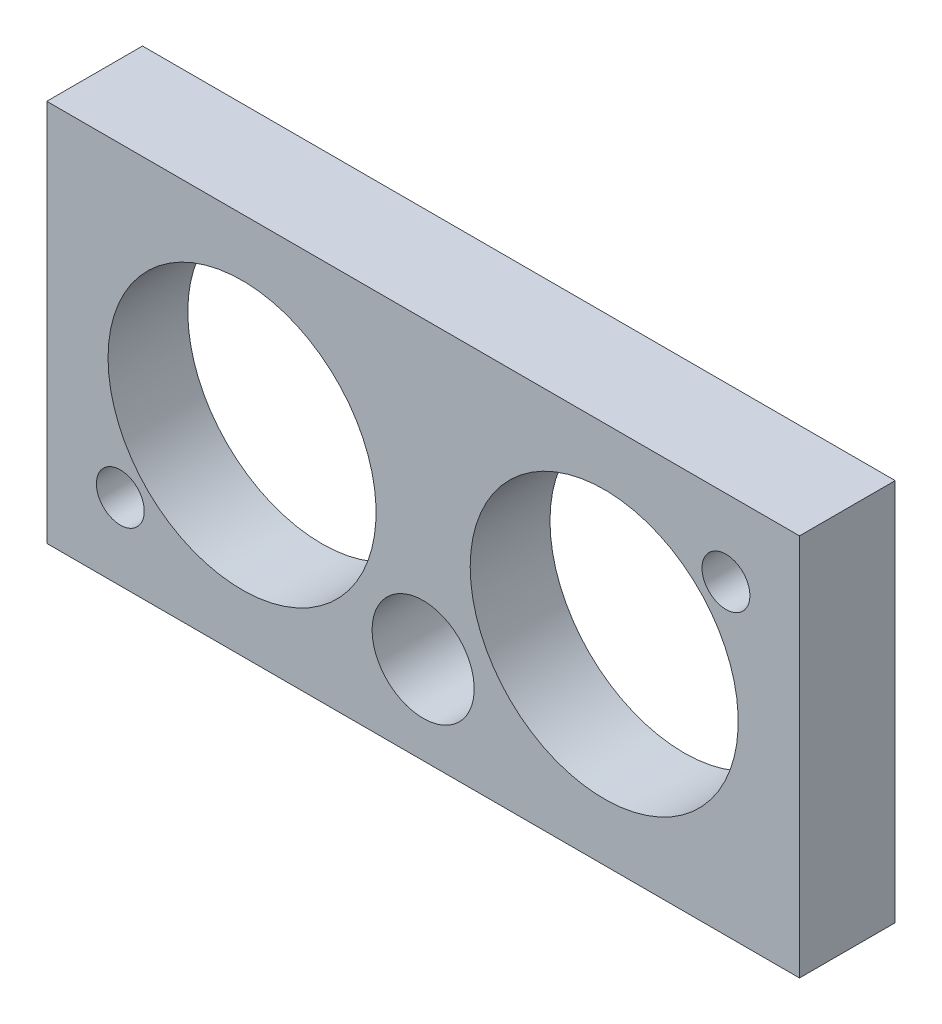
ISO-10303-21;
HEADER;
FILE_DESCRIPTION(('STEP AP214'),'2;1');
FILE_NAME('part.step','',(''),(''),'','','');
FILE_SCHEMA(('AUTOMOTIVE_DESIGN { 1 0 10303 214 1 1 1 1 }'));
ENDSEC;
DATA;
#1=APPLICATION_CONTEXT('core data for automotive mechanical design processes');
#2=APPLICATION_PROTOCOL_DEFINITION('international standard','automotive_design',2000,#1);
#3=PRODUCT_CONTEXT('',#1,'mechanical');
#4=PRODUCT('Part','Part','',(#3));
#5=PRODUCT_RELATED_PRODUCT_CATEGORY('part','',(#4));
#6=PRODUCT_DEFINITION_FORMATION('','',#4);
#7=PRODUCT_DEFINITION_CONTEXT('part definition',#1,'design');
#8=PRODUCT_DEFINITION('design','',#6,#7);
#9=PRODUCT_DEFINITION_SHAPE('','',#8);
#10=(LENGTH_UNIT() NAMED_UNIT(*) SI_UNIT(.MILLI.,.METRE.));
#11=(NAMED_UNIT(*) PLANE_ANGLE_UNIT() SI_UNIT($,.RADIAN.));
#12=(NAMED_UNIT(*) SI_UNIT($,.STERADIAN.) SOLID_ANGLE_UNIT());
#13=UNCERTAINTY_MEASURE_WITH_UNIT(LENGTH_MEASURE(1.E-05),#10,'distance_accuracy_value','');
#14=(GEOMETRIC_REPRESENTATION_CONTEXT(3) GLOBAL_UNCERTAINTY_ASSIGNED_CONTEXT((#13)) GLOBAL_UNIT_ASSIGNED_CONTEXT((#10,
#11,#12)) REPRESENTATION_CONTEXT('',''));
#15=CARTESIAN_POINT('',(0.,0.,0.));
#16=DIRECTION('',(0.,0.,1.));
#17=DIRECTION('',(1.,0.,0.));
#18=AXIS2_PLACEMENT_3D('',#15,#16,#17);
#19=CARTESIAN_POINT('',(-72.3984925993431,-20.8189630661845,2.07722565940972E-13));
#20=DIRECTION('',(0.,0.,1.));
#21=DIRECTION('',(1.,0.,0.));
#22=AXIS2_PLACEMENT_3D('',#19,#20,#21);
#23=PLANE('',#22);
#24=DIRECTION('',(0.,1.,0.));
#25=VECTOR('',#24,1.);
#26=CARTESIAN_POINT('',(-74.3984925993431,-22.8189630661845,2.08166817117217E-13));
#27=LINE('',#26,#25);
#28=CARTESIAN_POINT('',(-74.3984925993431,-22.8189630661845,2.08166817117217E-13));
#29=VERTEX_POINT('',#28);
#30=CARTESIAN_POINT('',(-74.3984925993431,1.18103693381549,2.08166817117217E-13));
#31=VERTEX_POINT('',#30);
#32=EDGE_CURVE('E47',#29,#31,#27,.T.);
#33=ORIENTED_EDGE('',*,*,#32,.T.);
#34=DIRECTION('',(1.,0.,0.));
#35=VECTOR('',#34,1.);
#36=CARTESIAN_POINT('',(-74.3984925993431,1.18103693381549,2.08166817117217E-13));
#37=LINE('',#36,#35);
#38=CARTESIAN_POINT('',(-27.2184925993431,1.18103693381549,2.08166817117217E-13));
#39=VERTEX_POINT('',#38);
#40=EDGE_CURVE('E218',#31,#39,#37,.T.);
#41=ORIENTED_EDGE('',*,*,#40,.T.);
#42=DIRECTION('',(0.,-1.,0.));
#43=VECTOR('',#42,1.);
#44=CARTESIAN_POINT('',(-27.2184925993431,-22.8189630661845,2.08166817117217E-13));
#45=LINE('',#44,#43);
#46=CARTESIAN_POINT('',(-27.2184925993431,-22.8189630661845,1.94289029309402E-13));
#47=VERTEX_POINT('',#46);
#48=EDGE_CURVE('E216',#39,#47,#45,.T.);
#49=ORIENTED_EDGE('',*,*,#48,.T.);
#50=DIRECTION('',(-1.,0.,0.));
#51=VECTOR('',#50,1.);
#52=CARTESIAN_POINT('',(-74.3984925993431,-22.8189630661845,2.08166817117217E-13));
#53=LINE('',#52,#51);
#54=EDGE_CURVE('E11',#47,#29,#53,.T.);
#55=ORIENTED_EDGE('',*,*,#54,.T.);
#56=EDGE_LOOP('',(#33,#41,#49,#55));
#57=FACE_BOUND('',#56,.T.);
#58=DIRECTION('',(0.,1.,0.));
#59=VECTOR('',#58,1.);
#60=CARTESIAN_POINT('',(-29.0184925993431,-0.618963066184508,2.08166817117217E-13));
#61=LINE('',#60,#59);
#62=CARTESIAN_POINT('',(-29.0184925993431,-21.0189630661845,2.07722565940972E-13));
#63=VERTEX_POINT('',#62);
#64=CARTESIAN_POINT('',(-29.0184925993431,-0.618963066184508,2.08166817117217E-13));
#65=VERTEX_POINT('',#64);
#66=EDGE_CURVE('E136',#63,#65,#61,.T.);
#67=ORIENTED_EDGE('',*,*,#66,.T.);
#68=DIRECTION('',(-1.,0.,0.));
#69=VECTOR('',#68,1.);
#70=CARTESIAN_POINT('',(-72.5984925993431,-0.618963066184508,2.08166817117217E-13));
#71=LINE('',#70,#69);
#72=CARTESIAN_POINT('',(-72.5984925993431,-0.618963066184508,2.08166817117217E-13));
#73=VERTEX_POINT('',#72);
#74=EDGE_CURVE('E164',#65,#73,#71,.T.);
#75=ORIENTED_EDGE('',*,*,#74,.T.);
#76=DIRECTION('',(0.,-1.,0.));
#77=VECTOR('',#76,1.);
#78=CARTESIAN_POINT('',(-72.5984925993431,-21.0189630661845,2.08166817117217E-13));
#79=LINE('',#78,#77);
#80=CARTESIAN_POINT('',(-72.5984925993431,-21.0189630661845,2.08166817117217E-13));
#81=VERTEX_POINT('',#80);
#82=EDGE_CURVE('E456',#73,#81,#79,.T.);
#83=ORIENTED_EDGE('',*,*,#82,.T.);
#84=DIRECTION('',(1.,0.,0.));
#85=VECTOR('',#84,1.);
#86=CARTESIAN_POINT('',(-29.0184925993431,-21.0189630661845,2.08166817117217E-13));
#87=LINE('',#86,#85);
#88=EDGE_CURVE('E133',#81,#63,#87,.T.);
#89=ORIENTED_EDGE('',*,*,#88,.T.);
#90=EDGE_LOOP('',(#67,#75,#83,#89));
#91=FACE_BOUND('',#90,.T.);
#92=ADVANCED_FACE('F38',(#57,#91),#23,.F.);
#93=CARTESIAN_POINT('',(-31.8282397032408,-3.61896306618451,6.00000000000021));
#94=DIRECTION('',(0.,0.,-1.));
#95=DIRECTION('',(-1.,0.,0.));
#96=AXIS2_PLACEMENT_3D('',#93,#94,#95);
#97=CYLINDRICAL_SURFACE('',#96,1.5);
#98=CARTESIAN_POINT('',(-31.8282397032408,-3.61896306618451,6.00000000000021));
#99=DIRECTION('',(0.,0.,-1.));
#100=DIRECTION('',(-1.,0.,0.));
#101=AXIS2_PLACEMENT_3D('',#98,#99,#100);
#102=CIRCLE('',#101,1.5);
#103=CARTESIAN_POINT('',(-33.3282397032408,-3.61896306618451,6.00000000000021));
#104=VERTEX_POINT('',#103);
#105=EDGE_CURVE('E205',#104,#104,#102,.T.);
#106=ORIENTED_EDGE('',*,*,#105,.F.);
#107=EDGE_LOOP('',(#106));
#108=FACE_BOUND('',#107,.T.);
#109=CARTESIAN_POINT('',(-31.8282397032408,-3.61896306618451,1.00000000000021));
#110=DIRECTION('',(0.,0.,-1.));
#111=DIRECTION('',(-1.,0.,0.));
#112=AXIS2_PLACEMENT_3D('',#109,#110,#111);
#113=CIRCLE('',#112,1.5);
#114=CARTESIAN_POINT('',(-33.3282397032408,-3.61896306618451,1.00000000000021));
#115=VERTEX_POINT('',#114);
#116=EDGE_CURVE('E42',#115,#115,#113,.F.);
#117=ORIENTED_EDGE('',*,*,#116,.F.);
#118=EDGE_LOOP('',(#117));
#119=FACE_BOUND('',#118,.T.);
#120=ADVANCED_FACE('F268',(#108,#119),#97,.F.);
#121=CARTESIAN_POINT('',(-69.7887454954455,-18.0189630661845,6.00000000000021));
#122=DIRECTION('',(0.,0.,-1.));
#123=DIRECTION('',(-1.,0.,0.));
#124=AXIS2_PLACEMENT_3D('',#121,#122,#123);
#125=CYLINDRICAL_SURFACE('',#124,1.5);
#126=CARTESIAN_POINT('',(-69.7887454954455,-18.0189630661845,6.00000000000021));
#127=DIRECTION('',(0.,0.,-1.));
#128=DIRECTION('',(-1.,0.,0.));
#129=AXIS2_PLACEMENT_3D('',#126,#127,#128);
#130=CIRCLE('',#129,1.5);
#131=CARTESIAN_POINT('',(-71.2887454954455,-18.0189630661845,6.00000000000021));
#132=VERTEX_POINT('',#131);
#133=EDGE_CURVE('E211',#132,#132,#130,.T.);
#134=ORIENTED_EDGE('',*,*,#133,.F.);
#135=EDGE_LOOP('',(#134));
#136=FACE_BOUND('',#135,.T.);
#137=CARTESIAN_POINT('',(-69.7887454954455,-18.0189630661845,1.00000000000021));
#138=DIRECTION('',(0.,0.,-1.));
#139=DIRECTION('',(-1.,0.,0.));
#140=AXIS2_PLACEMENT_3D('',#137,#138,#139);
#141=CIRCLE('',#140,1.5);
#142=CARTESIAN_POINT('',(-71.2887454954455,-18.0189630661845,1.00000000000021));
#143=VERTEX_POINT('',#142);
#144=EDGE_CURVE('E195',#143,#143,#141,.F.);
#145=ORIENTED_EDGE('',*,*,#144,.F.);
#146=EDGE_LOOP('',(#145));
#147=FACE_BOUND('',#146,.T.);
#148=ADVANCED_FACE('F274',(#136,#147),#125,.F.);
#149=CARTESIAN_POINT('',(-74.3984925993431,-22.8189630661845,-52.9334714523805));
#150=DIRECTION('',(-1.,0.,0.));
#151=DIRECTION('',(0.,0.,1.));
#152=AXIS2_PLACEMENT_3D('',#149,#150,#151);
#153=PLANE('',#152);
#154=ORIENTED_EDGE('',*,*,#32,.F.);
#155=DIRECTION('',(0.,0.,1.));
#156=VECTOR('',#155,1.);
#157=CARTESIAN_POINT('',(-74.3984925993431,-22.8189630661845,-52.9334714523805));
#158=LINE('',#157,#156);
#159=CARTESIAN_POINT('',(-74.3984925993431,-22.8189630661845,6.00000000000021));
#160=VERTEX_POINT('',#159);
#161=EDGE_CURVE('E233',#29,#160,#158,.T.);
#162=ORIENTED_EDGE('',*,*,#161,.T.);
#163=DIRECTION('',(0.,-1.,0.));
#164=VECTOR('',#163,1.);
#165=CARTESIAN_POINT('',(-74.3984925993431,-22.8189630661845,6.00000000000021));
#166=LINE('',#165,#164);
#167=CARTESIAN_POINT('',(-74.3984925993431,1.18103693381549,6.00000000000021));
#168=VERTEX_POINT('',#167);
#169=EDGE_CURVE('E214',#168,#160,#166,.T.);
#170=ORIENTED_EDGE('',*,*,#169,.F.);
#171=DIRECTION('',(0.,0.,1.));
#172=VECTOR('',#171,1.);
#173=CARTESIAN_POINT('',(-74.3984925993431,1.18103693381549,-52.9334714523805));
#174=LINE('',#173,#172);
#175=EDGE_CURVE('E219',#31,#168,#174,.T.);
#176=ORIENTED_EDGE('',*,*,#175,.F.);
#177=EDGE_LOOP('',(#154,#162,#170,#176));
#178=FACE_BOUND('',#177,.T.);
#179=ADVANCED_FACE('F40',(#178),#153,.T.);
#180=CARTESIAN_POINT('',(-74.3984925993431,1.18103693381549,-52.9334714523805));
#181=DIRECTION('',(0.,1.,0.));
#182=DIRECTION('',(0.,0.,1.));
#183=AXIS2_PLACEMENT_3D('',#180,#181,#182);
#184=PLANE('',#183);
#185=ORIENTED_EDGE('',*,*,#40,.F.);
#186=ORIENTED_EDGE('',*,*,#175,.T.);
#187=DIRECTION('',(-1.,0.,0.));
#188=VECTOR('',#187,1.);
#189=CARTESIAN_POINT('',(-74.3984925993431,1.18103693381549,6.00000000000021));
#190=LINE('',#189,#188);
#191=CARTESIAN_POINT('',(-27.2184925993431,1.18103693381549,6.00000000000021));
#192=VERTEX_POINT('',#191);
#193=EDGE_CURVE('E230',#192,#168,#190,.T.);
#194=ORIENTED_EDGE('',*,*,#193,.F.);
#195=DIRECTION('',(0.,0.,1.));
#196=VECTOR('',#195,1.);
#197=CARTESIAN_POINT('',(-27.2184925993431,1.18103693381549,-52.9334714523805));
#198=LINE('',#197,#196);
#199=EDGE_CURVE('E235',#39,#192,#198,.T.);
#200=ORIENTED_EDGE('',*,*,#199,.F.);
#201=EDGE_LOOP('',(#185,#186,#194,#200));
#202=FACE_BOUND('',#201,.T.);
#203=ADVANCED_FACE('F285',(#202),#184,.T.);
#204=CARTESIAN_POINT('',(-27.2184925993431,-22.8189630661845,-52.9334714523805));
#205=DIRECTION('',(1.,0.,0.));
#206=DIRECTION('',(0.,0.,-1.));
#207=AXIS2_PLACEMENT_3D('',#204,#205,#206);
#208=PLANE('',#207);
#209=ORIENTED_EDGE('',*,*,#48,.F.);
#210=ORIENTED_EDGE('',*,*,#199,.T.);
#211=DIRECTION('',(0.,1.,0.));
#212=VECTOR('',#211,1.);
#213=CARTESIAN_POINT('',(-27.2184925993431,-22.8189630661845,6.00000000000021));
#214=LINE('',#213,#212);
#215=CARTESIAN_POINT('',(-27.2184925993431,-22.8189630661845,6.00000000000021));
#216=VERTEX_POINT('',#215);
#217=EDGE_CURVE('E227',#216,#192,#214,.T.);
#218=ORIENTED_EDGE('',*,*,#217,.F.);
#219=DIRECTION('',(0.,0.,1.));
#220=VECTOR('',#219,1.);
#221=CARTESIAN_POINT('',(-27.2184925993431,-22.8189630661845,-52.9334714523805));
#222=LINE('',#221,#220);
#223=EDGE_CURVE('E237',#47,#216,#222,.T.);
#224=ORIENTED_EDGE('',*,*,#223,.F.);
#225=EDGE_LOOP('',(#209,#210,#218,#224));
#226=FACE_BOUND('',#225,.T.);
#227=ADVANCED_FACE('F288',(#226),#208,.T.);
#228=CARTESIAN_POINT('',(-74.3984925993431,-22.8189630661845,-52.9334714523805));
#229=DIRECTION('',(0.,-1.,0.));
#230=DIRECTION('',(0.,0.,-1.));
#231=AXIS2_PLACEMENT_3D('',#228,#229,#230);
#232=PLANE('',#231);
#233=ORIENTED_EDGE('',*,*,#54,.F.);
#234=ORIENTED_EDGE('',*,*,#223,.T.);
#235=DIRECTION('',(1.,0.,0.));
#236=VECTOR('',#235,1.);
#237=CARTESIAN_POINT('',(-74.3984925993431,-22.8189630661845,6.00000000000021));
#238=LINE('',#237,#236);
#239=EDGE_CURVE('E224',#160,#216,#238,.T.);
#240=ORIENTED_EDGE('',*,*,#239,.F.);
#241=ORIENTED_EDGE('',*,*,#161,.F.);
#242=EDGE_LOOP('',(#233,#234,#240,#241));
#243=FACE_BOUND('',#242,.T.);
#244=ADVANCED_FACE('F283',(#243),#232,.T.);
#245=CARTESIAN_POINT('',(0.,0.,6.00000000000021));
#246=DIRECTION('',(0.,0.,-1.));
#247=DIRECTION('',(-1.,0.,0.));
#248=AXIS2_PLACEMENT_3D('',#245,#246,#247);
#249=PLANE('',#248);
#250=CARTESIAN_POINT('',(-39.4584925993431,-10.8189630661845,6.00000000000021));
#251=DIRECTION('',(0.,0.,-1.));
#252=DIRECTION('',(-1.,0.,0.));
#253=AXIS2_PLACEMENT_3D('',#250,#251,#252);
#254=CIRCLE('',#253,8.4);
#255=CARTESIAN_POINT('',(-47.8584925993431,-10.8189630661845,6.00000000000021));
#256=VERTEX_POINT('',#255);
#257=EDGE_CURVE('E198',#256,#256,#254,.T.);
#258=ORIENTED_EDGE('',*,*,#257,.T.);
#259=EDGE_LOOP('',(#258));
#260=FACE_BOUND('',#259,.T.);
#261=CARTESIAN_POINT('',(-62.1584925993431,-10.8189630661845,6.00000000000021));
#262=DIRECTION('',(0.,0.,-1.));
#263=DIRECTION('',(-1.,0.,0.));
#264=AXIS2_PLACEMENT_3D('',#261,#262,#263);
#265=CIRCLE('',#264,8.4);
#266=CARTESIAN_POINT('',(-70.5584925993431,-10.8189630661845,6.00000000000021));
#267=VERTEX_POINT('',#266);
#268=EDGE_CURVE('E199',#267,#267,#265,.T.);
#269=ORIENTED_EDGE('',*,*,#268,.T.);
#270=EDGE_LOOP('',(#269));
#271=FACE_BOUND('',#270,.T.);
#272=CARTESIAN_POINT('',(-50.8084925993431,-17.3189630661845,6.00000000000021));
#273=DIRECTION('',(0.,0.,-1.));
#274=DIRECTION('',(-1.,0.,0.));
#275=AXIS2_PLACEMENT_3D('',#272,#273,#274);
#276=CIRCLE('',#275,3.2);
#277=CARTESIAN_POINT('',(-54.0084925993431,-17.3189630661845,6.00000000000021));
#278=VERTEX_POINT('',#277);
#279=EDGE_CURVE('E202',#278,#278,#276,.T.);
#280=ORIENTED_EDGE('',*,*,#279,.T.);
#281=EDGE_LOOP('',(#280));
#282=FACE_BOUND('',#281,.T.);
#283=ORIENTED_EDGE('',*,*,#105,.T.);
#284=EDGE_LOOP('',(#283));
#285=FACE_BOUND('',#284,.T.);
#286=ORIENTED_EDGE('',*,*,#133,.T.);
#287=EDGE_LOOP('',(#286));
#288=FACE_BOUND('',#287,.T.);
#289=ORIENTED_EDGE('',*,*,#169,.T.);
#290=ORIENTED_EDGE('',*,*,#239,.T.);
#291=ORIENTED_EDGE('',*,*,#217,.T.);
#292=ORIENTED_EDGE('',*,*,#193,.T.);
#293=EDGE_LOOP('',(#289,#290,#291,#292));
#294=FACE_BOUND('',#293,.T.);
#295=ADVANCED_FACE('F280',(#260,#271,#282,#285,#288,#294),#249,.F.);
#296=CARTESIAN_POINT('',(-72.3984925993431,-20.8189630661845,1.00000000000021));
#297=DIRECTION('',(0.,0.,1.));
#298=DIRECTION('',(1.,0.,0.));
#299=AXIS2_PLACEMENT_3D('',#296,#297,#298);
#300=PLANE('',#299);
#301=DIRECTION('',(0.,-1.,0.));
#302=VECTOR('',#301,1.);
#303=CARTESIAN_POINT('',(-44.7284925993431,-3.15416136988079,1.00000000000021));
#304=LINE('',#303,#302);
#305=CARTESIAN_POINT('',(-44.7284925993431,-1.15416136988079,1.00000000000021));
#306=VERTEX_POINT('',#305);
#307=CARTESIAN_POINT('',(-44.7284925993431,-3.15416136988079,1.00000000000021));
#308=VERTEX_POINT('',#307);
#309=EDGE_CURVE('E167',#306,#308,#304,.T.);
#310=ORIENTED_EDGE('',*,*,#309,.F.);
#311=DIRECTION('',(1.,0.,0.));
#312=VECTOR('',#311,1.);
#313=CARTESIAN_POINT('',(-56.8884925993431,-1.15416136988079,1.00000000000021));
#314=LINE('',#313,#312);
#315=CARTESIAN_POINT('',(-56.8884925993431,-1.15416136988079,1.00000000000021));
#316=VERTEX_POINT('',#315);
#317=EDGE_CURVE('E170',#316,#306,#314,.T.);
#318=ORIENTED_EDGE('',*,*,#317,.F.);
#319=DIRECTION('',(0.,1.,0.));
#320=VECTOR('',#319,1.);
#321=CARTESIAN_POINT('',(-56.8884925993431,-3.15416136988079,1.00000000000021));
#322=LINE('',#321,#320);
#323=CARTESIAN_POINT('',(-56.8884925993431,-3.15416136988079,1.00000000000021));
#324=VERTEX_POINT('',#323);
#325=EDGE_CURVE('E173',#324,#316,#322,.T.);
#326=ORIENTED_EDGE('',*,*,#325,.F.);
#327=DIRECTION('',(-1.,0.,0.));
#328=VECTOR('',#327,1.);
#329=CARTESIAN_POINT('',(-56.8884925993431,-3.15416136988079,1.00000000000021));
#330=LINE('',#329,#328);
#331=EDGE_CURVE('E63',#308,#324,#330,.T.);
#332=ORIENTED_EDGE('',*,*,#331,.F.);
#333=EDGE_LOOP('',(#310,#318,#326,#332));
#334=FACE_BOUND('',#333,.T.);
#335=CARTESIAN_POINT('',(-62.1584925993431,-10.8189630661845,1.00000000000021));
#336=DIRECTION('',(0.,0.,1.));
#337=DIRECTION('',(1.,0.,0.));
#338=AXIS2_PLACEMENT_3D('',#335,#336,#337);
#339=CIRCLE('',#338,8.4);
#340=CARTESIAN_POINT('',(-53.7584925993431,-10.8189630661845,1.00000000000021));
#341=VERTEX_POINT('',#340);
#342=EDGE_CURVE('E242',#341,#341,#339,.T.);
#343=ORIENTED_EDGE('',*,*,#342,.T.);
#344=EDGE_LOOP('',(#343));
#345=FACE_BOUND('',#344,.T.);
#346=CARTESIAN_POINT('',(-39.4584925993431,-10.8189630661845,1.00000000000021));
#347=DIRECTION('',(0.,0.,1.));
#348=DIRECTION('',(1.,0.,0.));
#349=AXIS2_PLACEMENT_3D('',#346,#347,#348);
#350=CIRCLE('',#349,8.4);
#351=CARTESIAN_POINT('',(-31.0584925993431,-10.8189630661845,1.00000000000021));
#352=VERTEX_POINT('',#351);
#353=EDGE_CURVE('E215',#352,#352,#350,.T.);
#354=ORIENTED_EDGE('',*,*,#353,.T.);
#355=EDGE_LOOP('',(#354));
#356=FACE_BOUND('',#355,.T.);
#357=CARTESIAN_POINT('',(-50.8084925993431,-17.3189630661845,1.00000000000021));
#358=DIRECTION('',(0.,0.,1.));
#359=DIRECTION('',(1.,0.,0.));
#360=AXIS2_PLACEMENT_3D('',#357,#358,#359);
#361=CIRCLE('',#360,3.2);
#362=CARTESIAN_POINT('',(-47.6084925993431,-17.3189630661845,1.00000000000021));
#363=VERTEX_POINT('',#362);
#364=EDGE_CURVE('E208',#363,#363,#361,.T.);
#365=ORIENTED_EDGE('',*,*,#364,.T.);
#366=EDGE_LOOP('',(#365));
#367=FACE_BOUND('',#366,.T.);
#368=ORIENTED_EDGE('',*,*,#144,.T.);
#369=EDGE_LOOP('',(#368));
#370=FACE_BOUND('',#369,.T.);
#371=ORIENTED_EDGE('',*,*,#116,.T.);
#372=EDGE_LOOP('',(#371));
#373=FACE_BOUND('',#372,.T.);
#374=DIRECTION('',(-1.,0.,0.));
#375=VECTOR('',#374,1.);
#376=CARTESIAN_POINT('',(-29.0184925993431,-21.0189630661845,1.00000000000021));
#377=LINE('',#376,#375);
#378=CARTESIAN_POINT('',(-29.0184925993431,-21.0189630661845,1.00000000000021));
#379=VERTEX_POINT('',#378);
#380=CARTESIAN_POINT('',(-72.5984925993431,-21.0189630661845,1.00000000000021));
#381=VERTEX_POINT('',#380);
#382=EDGE_CURVE('E131',#379,#381,#377,.T.);
#383=ORIENTED_EDGE('',*,*,#382,.T.);
#384=DIRECTION('',(0.,1.,0.));
#385=VECTOR('',#384,1.);
#386=CARTESIAN_POINT('',(-72.5984925993431,-21.0189630661845,1.00000000000021));
#387=LINE('',#386,#385);
#388=CARTESIAN_POINT('',(-72.5984925993431,-0.618963066184508,1.00000000000021));
#389=VERTEX_POINT('',#388);
#390=EDGE_CURVE('E140',#381,#389,#387,.T.);
#391=ORIENTED_EDGE('',*,*,#390,.T.);
#392=DIRECTION('',(1.,0.,0.));
#393=VECTOR('',#392,1.);
#394=CARTESIAN_POINT('',(-72.5984925993431,-0.618963066184508,1.00000000000021));
#395=LINE('',#394,#393);
#396=CARTESIAN_POINT('',(-29.0184925993431,-0.618963066184508,1.00000000000021));
#397=VERTEX_POINT('',#396);
#398=EDGE_CURVE('E146',#389,#397,#395,.T.);
#399=ORIENTED_EDGE('',*,*,#398,.T.);
#400=DIRECTION('',(0.,-1.,0.));
#401=VECTOR('',#400,1.);
#402=CARTESIAN_POINT('',(-29.0184925993431,-0.618963066184508,1.00000000000021));
#403=LINE('',#402,#401);
#404=EDGE_CURVE('E151',#397,#379,#403,.T.);
#405=ORIENTED_EDGE('',*,*,#404,.T.);
#406=EDGE_LOOP('',(#383,#391,#399,#405));
#407=FACE_BOUND('',#406,.T.);
#408=ADVANCED_FACE('F149',(#334,#345,#356,#367,#370,#373,#407),#300,.F.);
#409=CARTESIAN_POINT('',(-50.8084925993431,-17.3189630661845,6.00000000000021));
#410=DIRECTION('',(0.,0.,-1.));
#411=DIRECTION('',(-1.,0.,0.));
#412=AXIS2_PLACEMENT_3D('',#409,#410,#411);
#413=CYLINDRICAL_SURFACE('',#412,3.2);
#414=ORIENTED_EDGE('',*,*,#279,.F.);
#415=EDGE_LOOP('',(#414));
#416=FACE_BOUND('',#415,.T.);
#417=ORIENTED_EDGE('',*,*,#364,.F.);
#418=EDGE_LOOP('',(#417));
#419=FACE_BOUND('',#418,.T.);
#420=ADVANCED_FACE('F262',(#416,#419),#413,.F.);
#421=CARTESIAN_POINT('',(-62.1584925993431,-10.8189630661845,6.00000000000021));
#422=DIRECTION('',(0.,0.,-1.));
#423=DIRECTION('',(-1.,0.,0.));
#424=AXIS2_PLACEMENT_3D('',#421,#422,#423);
#425=CYLINDRICAL_SURFACE('',#424,8.4);
#426=ORIENTED_EDGE('',*,*,#268,.F.);
#427=EDGE_LOOP('',(#426));
#428=FACE_BOUND('',#427,.T.);
#429=ORIENTED_EDGE('',*,*,#342,.F.);
#430=EDGE_LOOP('',(#429));
#431=FACE_BOUND('',#430,.T.);
#432=ADVANCED_FACE('F252',(#428,#431),#425,.F.);
#433=CARTESIAN_POINT('',(-39.4584925993431,-10.8189630661845,6.00000000000021));
#434=DIRECTION('',(0.,0.,-1.));
#435=DIRECTION('',(-1.,0.,0.));
#436=AXIS2_PLACEMENT_3D('',#433,#434,#435);
#437=CYLINDRICAL_SURFACE('',#436,8.4);
#438=ORIENTED_EDGE('',*,*,#257,.F.);
#439=EDGE_LOOP('',(#438));
#440=FACE_BOUND('',#439,.T.);
#441=ORIENTED_EDGE('',*,*,#353,.F.);
#442=EDGE_LOOP('',(#441));
#443=FACE_BOUND('',#442,.T.);
#444=ADVANCED_FACE('F249',(#440,#443),#437,.F.);
#445=CARTESIAN_POINT('',(-56.8884925993431,-1.15416136988079,14.8233761607769));
#446=DIRECTION('',(0.,1.,0.));
#447=DIRECTION('',(-1.,0.,0.));
#448=AXIS2_PLACEMENT_3D('',#445,#446,#447);
#449=PLANE('',#448);
#450=DIRECTION('',(0.,0.,-1.));
#451=VECTOR('',#450,1.);
#452=CARTESIAN_POINT('',(-56.8884925993431,-1.15416136988079,14.8233761607769));
#453=LINE('',#452,#451);
#454=CARTESIAN_POINT('',(-56.8884925993431,-1.15416136988079,2.50000000000021));
#455=VERTEX_POINT('',#454);
#456=EDGE_CURVE('E182',#455,#316,#453,.T.);
#457=ORIENTED_EDGE('',*,*,#456,.T.);
#458=ORIENTED_EDGE('',*,*,#317,.T.);
#459=DIRECTION('',(0.,0.,-1.));
#460=VECTOR('',#459,1.);
#461=CARTESIAN_POINT('',(-44.7284925993431,-1.15416136988079,14.8233761607769));
#462=LINE('',#461,#460);
#463=CARTESIAN_POINT('',(-44.7284925993431,-1.15416136988079,2.50000000000021));
#464=VERTEX_POINT('',#463);
#465=EDGE_CURVE('E178',#464,#306,#462,.T.);
#466=ORIENTED_EDGE('',*,*,#465,.F.);
#467=DIRECTION('',(1.,0.,0.));
#468=VECTOR('',#467,1.);
#469=CARTESIAN_POINT('',(-56.8884925993431,-1.15416136988079,2.50000000000021));
#470=LINE('',#469,#468);
#471=EDGE_CURVE('E166',#455,#464,#470,.T.);
#472=ORIENTED_EDGE('',*,*,#471,.F.);
#473=EDGE_LOOP('',(#457,#458,#466,#472));
#474=FACE_BOUND('',#473,.T.);
#475=ADVANCED_FACE('F251',(#474),#449,.F.);
#476=CARTESIAN_POINT('',(-44.7284925993431,-3.15416136988079,14.8233761607769));
#477=DIRECTION('',(1.,0.,0.));
#478=DIRECTION('',(0.,0.,-1.));
#479=AXIS2_PLACEMENT_3D('',#476,#477,#478);
#480=PLANE('',#479);
#481=ORIENTED_EDGE('',*,*,#465,.T.);
#482=ORIENTED_EDGE('',*,*,#309,.T.);
#483=DIRECTION('',(0.,0.,-1.));
#484=VECTOR('',#483,1.);
#485=CARTESIAN_POINT('',(-44.7284925993431,-3.15416136988079,14.8233761607769));
#486=LINE('',#485,#484);
#487=CARTESIAN_POINT('',(-44.7284925993431,-3.15416136988079,2.50000000000021));
#488=VERTEX_POINT('',#487);
#489=EDGE_CURVE('E187',#488,#308,#486,.T.);
#490=ORIENTED_EDGE('',*,*,#489,.F.);
#491=DIRECTION('',(0.,-1.,0.));
#492=VECTOR('',#491,1.);
#493=CARTESIAN_POINT('',(-44.7284925993431,-3.15416136988079,2.50000000000021));
#494=LINE('',#493,#492);
#495=EDGE_CURVE('E188',#464,#488,#494,.T.);
#496=ORIENTED_EDGE('',*,*,#495,.F.);
#497=EDGE_LOOP('',(#481,#482,#490,#496));
#498=FACE_BOUND('',#497,.T.);
#499=ADVANCED_FACE('F259',(#498),#480,.F.);
#500=CARTESIAN_POINT('',(-56.8884925993431,-3.15416136988079,14.8233761607769));
#501=DIRECTION('',(0.,-1.,0.));
#502=DIRECTION('',(1.,0.,0.));
#503=AXIS2_PLACEMENT_3D('',#500,#501,#502);
#504=PLANE('',#503);
#505=ORIENTED_EDGE('',*,*,#489,.T.);
#506=ORIENTED_EDGE('',*,*,#331,.T.);
#507=DIRECTION('',(0.,0.,-1.));
#508=VECTOR('',#507,1.);
#509=CARTESIAN_POINT('',(-56.8884925993431,-3.15416136988079,14.8233761607769));
#510=LINE('',#509,#508);
#511=CARTESIAN_POINT('',(-56.8884925993431,-3.15416136988079,2.50000000000021));
#512=VERTEX_POINT('',#511);
#513=EDGE_CURVE('E183',#512,#324,#510,.T.);
#514=ORIENTED_EDGE('',*,*,#513,.F.);
#515=DIRECTION('',(-1.,0.,0.));
#516=VECTOR('',#515,1.);
#517=CARTESIAN_POINT('',(-56.8884925993431,-3.15416136988079,2.50000000000021));
#518=LINE('',#517,#516);
#519=EDGE_CURVE('E184',#488,#512,#518,.T.);
#520=ORIENTED_EDGE('',*,*,#519,.F.);
#521=EDGE_LOOP('',(#505,#506,#514,#520));
#522=FACE_BOUND('',#521,.T.);
#523=ADVANCED_FACE('F333',(#522),#504,.F.);
#524=CARTESIAN_POINT('',(-56.8884925993431,-3.15416136988079,14.8233761607769));
#525=DIRECTION('',(-1.,0.,0.));
#526=DIRECTION('',(0.,0.,1.));
#527=AXIS2_PLACEMENT_3D('',#524,#525,#526);
#528=PLANE('',#527);
#529=ORIENTED_EDGE('',*,*,#513,.T.);
#530=ORIENTED_EDGE('',*,*,#325,.T.);
#531=ORIENTED_EDGE('',*,*,#456,.F.);
#532=DIRECTION('',(0.,1.,0.));
#533=VECTOR('',#532,1.);
#534=CARTESIAN_POINT('',(-56.8884925993431,-3.15416136988079,2.50000000000021));
#535=LINE('',#534,#533);
#536=EDGE_CURVE('E179',#512,#455,#535,.T.);
#537=ORIENTED_EDGE('',*,*,#536,.F.);
#538=EDGE_LOOP('',(#529,#530,#531,#537));
#539=FACE_BOUND('',#538,.T.);
#540=ADVANCED_FACE('F324',(#539),#528,.F.);
#541=CARTESIAN_POINT('',(-56.1583976567059,-2.41507063777795,2.50000000000021));
#542=DIRECTION('',(0.,0.,1.));
#543=DIRECTION('',(1.,0.,0.));
#544=AXIS2_PLACEMENT_3D('',#541,#542,#543);
#545=PLANE('',#544);
#546=ORIENTED_EDGE('',*,*,#536,.T.);
#547=ORIENTED_EDGE('',*,*,#471,.T.);
#548=ORIENTED_EDGE('',*,*,#495,.T.);
#549=ORIENTED_EDGE('',*,*,#519,.T.);
#550=EDGE_LOOP('',(#546,#547,#548,#549));
#551=FACE_BOUND('',#550,.T.);
#552=ADVANCED_FACE('F321',(#551),#545,.F.);
#553=CARTESIAN_POINT('',(-29.0184925993431,-0.618963066184508,-48.1183582429823));
#554=DIRECTION('',(-1.,0.,0.));
#555=DIRECTION('',(0.,0.,1.));
#556=AXIS2_PLACEMENT_3D('',#553,#554,#555);
#557=PLANE('',#556);
#558=DIRECTION('',(0.,0.,1.));
#559=VECTOR('',#558,1.);
#560=CARTESIAN_POINT('',(-29.0184925993431,-21.0189630661845,-48.1183582429823));
#561=LINE('',#560,#559);
#562=EDGE_CURVE('E55',#63,#379,#561,.T.);
#563=ORIENTED_EDGE('',*,*,#562,.T.);
#564=ORIENTED_EDGE('',*,*,#404,.F.);
#565=DIRECTION('',(0.,0.,1.));
#566=VECTOR('',#565,1.);
#567=CARTESIAN_POINT('',(-29.0184925993431,-0.618963066184508,-48.1183582429823));
#568=LINE('',#567,#566);
#569=EDGE_CURVE('E159',#65,#397,#568,.T.);
#570=ORIENTED_EDGE('',*,*,#569,.F.);
#571=ORIENTED_EDGE('',*,*,#66,.F.);
#572=EDGE_LOOP('',(#563,#564,#570,#571));
#573=FACE_BOUND('',#572,.T.);
#574=ADVANCED_FACE('F323',(#573),#557,.T.);
#575=CARTESIAN_POINT('',(-72.5984925993431,-0.618963066184508,-48.1183582429823));
#576=DIRECTION('',(0.,-1.,0.));
#577=DIRECTION('',(0.,0.,-1.));
#578=AXIS2_PLACEMENT_3D('',#575,#576,#577);
#579=PLANE('',#578);
#580=ORIENTED_EDGE('',*,*,#569,.T.);
#581=ORIENTED_EDGE('',*,*,#398,.F.);
#582=DIRECTION('',(0.,0.,1.));
#583=VECTOR('',#582,1.);
#584=CARTESIAN_POINT('',(-72.5984925993431,-0.618963066184508,-48.1183582429823));
#585=LINE('',#584,#583);
#586=EDGE_CURVE('E137',#73,#389,#585,.T.);
#587=ORIENTED_EDGE('',*,*,#586,.F.);
#588=ORIENTED_EDGE('',*,*,#74,.F.);
#589=EDGE_LOOP('',(#580,#581,#587,#588));
#590=FACE_BOUND('',#589,.T.);
#591=ADVANCED_FACE('F330',(#590),#579,.T.);
#592=CARTESIAN_POINT('',(-72.5984925993431,-21.0189630661845,-48.1183582429823));
#593=DIRECTION('',(1.,0.,0.));
#594=DIRECTION('',(0.,0.,-1.));
#595=AXIS2_PLACEMENT_3D('',#592,#593,#594);
#596=PLANE('',#595);
#597=ORIENTED_EDGE('',*,*,#586,.T.);
#598=ORIENTED_EDGE('',*,*,#390,.F.);
#599=DIRECTION('',(0.,0.,1.));
#600=VECTOR('',#599,1.);
#601=CARTESIAN_POINT('',(-72.5984925993431,-21.0189630661845,-48.1183582429823));
#602=LINE('',#601,#600);
#603=EDGE_CURVE('E127',#81,#381,#602,.T.);
#604=ORIENTED_EDGE('',*,*,#603,.F.);
#605=ORIENTED_EDGE('',*,*,#82,.F.);
#606=EDGE_LOOP('',(#597,#598,#604,#605));
#607=FACE_BOUND('',#606,.T.);
#608=ADVANCED_FACE('F141',(#607),#596,.T.);
#609=CARTESIAN_POINT('',(-29.0184925993431,-21.0189630661845,-48.1183582429823));
#610=DIRECTION('',(0.,1.,0.));
#611=DIRECTION('',(0.,0.,1.));
#612=AXIS2_PLACEMENT_3D('',#609,#610,#611);
#613=PLANE('',#612);
#614=ORIENTED_EDGE('',*,*,#603,.T.);
#615=ORIENTED_EDGE('',*,*,#382,.F.);
#616=ORIENTED_EDGE('',*,*,#562,.F.);
#617=ORIENTED_EDGE('',*,*,#88,.F.);
#618=EDGE_LOOP('',(#614,#615,#616,#617));
#619=FACE_BOUND('',#618,.T.);
#620=ADVANCED_FACE('F129',(#619),#613,.T.);
#621=CLOSED_SHELL('',(#92,#120,#148,#179,#203,#227,#244,#295,#408,#420,#432,#444,#475,#499,#523,
#540,#552,#574,#591,#608,#620));
#622=MANIFOLD_SOLID_BREP('B2',#621);
#623=ADVANCED_BREP_SHAPE_REPRESENTATION('',(#18,#622),#14);
#624=SHAPE_DEFINITION_REPRESENTATION(#9,#623);
ENDSEC;
END-ISO-10303-21;
